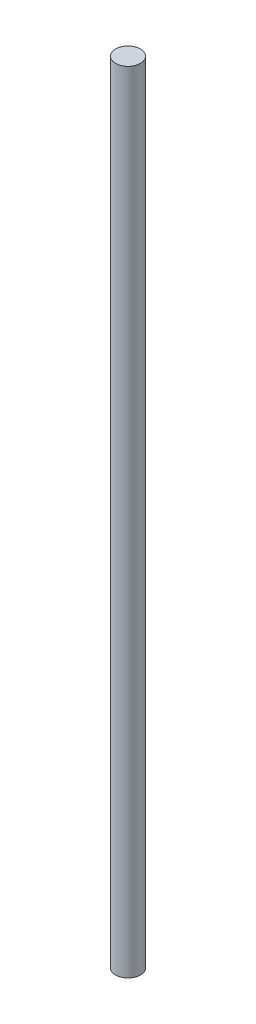
ISO-10303-21;
HEADER;
FILE_DESCRIPTION(('STEP AP214'),'2;1');
FILE_NAME('part.step','',(''),(''),'','','');
FILE_SCHEMA(('AUTOMOTIVE_DESIGN { 1 0 10303 214 1 1 1 1 }'));
ENDSEC;
DATA;
#1=APPLICATION_CONTEXT('core data for automotive mechanical design processes');
#2=APPLICATION_PROTOCOL_DEFINITION('international standard','automotive_design',2000,#1);
#3=PRODUCT_CONTEXT('',#1,'mechanical');
#4=PRODUCT('Part','Part','',(#3));
#5=PRODUCT_RELATED_PRODUCT_CATEGORY('part','',(#4));
#6=PRODUCT_DEFINITION_FORMATION('','',#4);
#7=PRODUCT_DEFINITION_CONTEXT('part definition',#1,'design');
#8=PRODUCT_DEFINITION('design','',#6,#7);
#9=PRODUCT_DEFINITION_SHAPE('','',#8);
#10=(LENGTH_UNIT() NAMED_UNIT(*) SI_UNIT(.MILLI.,.METRE.));
#11=(NAMED_UNIT(*) PLANE_ANGLE_UNIT() SI_UNIT($,.RADIAN.));
#12=(NAMED_UNIT(*) SI_UNIT($,.STERADIAN.) SOLID_ANGLE_UNIT());
#13=UNCERTAINTY_MEASURE_WITH_UNIT(LENGTH_MEASURE(1.E-05),#10,'distance_accuracy_value','');
#14=(GEOMETRIC_REPRESENTATION_CONTEXT(3) GLOBAL_UNCERTAINTY_ASSIGNED_CONTEXT((#13)) GLOBAL_UNIT_ASSIGNED_CONTEXT((#10,
#11,#12)) REPRESENTATION_CONTEXT('',''));
#15=CARTESIAN_POINT('',(0.,0.,0.));
#16=DIRECTION('',(0.,0.,1.));
#17=DIRECTION('',(1.,0.,0.));
#18=AXIS2_PLACEMENT_3D('',#15,#16,#17);
#19=CARTESIAN_POINT('',(150.,780.,-300.));
#20=DIRECTION('',(0.,-1.,0.));
#21=DIRECTION('',(0.,0.,-1.));
#22=AXIS2_PLACEMENT_3D('',#19,#20,#21);
#23=CYLINDRICAL_SURFACE('',#22,6.00000000000001);
#24=CARTESIAN_POINT('',(150.,780.,-300.));
#25=DIRECTION('',(0.,1.,0.));
#26=DIRECTION('',(0.,0.,1.));
#27=AXIS2_PLACEMENT_3D('',#24,#25,#26);
#28=CIRCLE('',#27,6.00000000000001);
#29=CARTESIAN_POINT('',(150.,780.,-294.));
#30=VERTEX_POINT('',#29);
#31=EDGE_CURVE('E10',#30,#30,#28,.T.);
#32=ORIENTED_EDGE('',*,*,#31,.F.);
#33=EDGE_LOOP('',(#32));
#34=FACE_BOUND('',#33,.T.);
#35=CARTESIAN_POINT('',(150.,400.,-300.));
#36=DIRECTION('',(0.,1.,0.));
#37=DIRECTION('',(0.,0.,1.));
#38=AXIS2_PLACEMENT_3D('',#35,#36,#37);
#39=CIRCLE('',#38,6.00000000000001);
#40=CARTESIAN_POINT('',(150.,400.,-294.));
#41=VERTEX_POINT('',#40);
#42=EDGE_CURVE('E40',#41,#41,#39,.T.);
#43=ORIENTED_EDGE('',*,*,#42,.T.);
#44=EDGE_LOOP('',(#43));
#45=FACE_BOUND('',#44,.T.);
#46=ADVANCED_FACE('F37',(#34,#45),#23,.T.);
#47=CARTESIAN_POINT('',(150.,780.,-300.));
#48=DIRECTION('',(0.,1.,0.));
#49=DIRECTION('',(0.,0.,1.));
#50=AXIS2_PLACEMENT_3D('',#47,#48,#49);
#51=PLANE('',#50);
#52=ORIENTED_EDGE('',*,*,#31,.T.);
#53=EDGE_LOOP('',(#52));
#54=FACE_BOUND('',#53,.T.);
#55=ADVANCED_FACE('F52',(#54),#51,.T.);
#56=CARTESIAN_POINT('',(150.,400.,-300.));
#57=DIRECTION('',(0.,1.,0.));
#58=DIRECTION('',(0.,0.,1.));
#59=AXIS2_PLACEMENT_3D('',#56,#57,#58);
#60=PLANE('',#59);
#61=ORIENTED_EDGE('',*,*,#42,.F.);
#62=EDGE_LOOP('',(#61));
#63=FACE_BOUND('',#62,.T.);
#64=ADVANCED_FACE('F50',(#63),#60,.F.);
#65=CLOSED_SHELL('',(#46,#55,#64));
#66=MANIFOLD_SOLID_BREP('B2',#65);
#67=ADVANCED_BREP_SHAPE_REPRESENTATION('',(#18,#66),#14);
#68=SHAPE_DEFINITION_REPRESENTATION(#9,#67);
ENDSEC;
END-ISO-10303-21;
